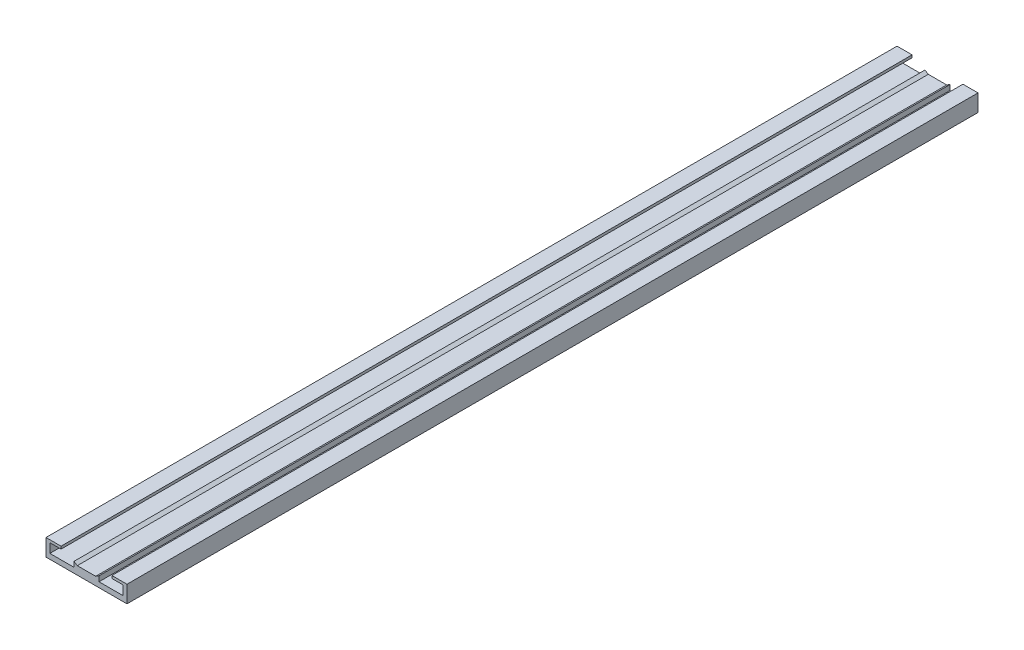
ISO-10303-21;
HEADER;
FILE_DESCRIPTION(('STEP AP214'),'2;1');
FILE_NAME('part.step','',(''),(''),'','','');
FILE_SCHEMA(('AUTOMOTIVE_DESIGN { 1 0 10303 214 1 1 1 1 }'));
ENDSEC;
DATA;
#1=APPLICATION_CONTEXT('core data for automotive mechanical design processes');
#2=APPLICATION_PROTOCOL_DEFINITION('international standard','automotive_design',2000,#1);
#3=PRODUCT_CONTEXT('',#1,'mechanical');
#4=PRODUCT('Part','Part','',(#3));
#5=PRODUCT_RELATED_PRODUCT_CATEGORY('part','',(#4));
#6=PRODUCT_DEFINITION_FORMATION('','',#4);
#7=PRODUCT_DEFINITION_CONTEXT('part definition',#1,'design');
#8=PRODUCT_DEFINITION('design','',#6,#7);
#9=PRODUCT_DEFINITION_SHAPE('','',#8);
#10=(LENGTH_UNIT() NAMED_UNIT(*) SI_UNIT(.MILLI.,.METRE.));
#11=(NAMED_UNIT(*) PLANE_ANGLE_UNIT() SI_UNIT($,.RADIAN.));
#12=(NAMED_UNIT(*) SI_UNIT($,.STERADIAN.) SOLID_ANGLE_UNIT());
#13=UNCERTAINTY_MEASURE_WITH_UNIT(LENGTH_MEASURE(1.E-05),#10,'distance_accuracy_value','');
#14=(GEOMETRIC_REPRESENTATION_CONTEXT(3) GLOBAL_UNCERTAINTY_ASSIGNED_CONTEXT((#13)) GLOBAL_UNIT_ASSIGNED_CONTEXT((#10,
#11,#12)) REPRESENTATION_CONTEXT('',''));
#15=CARTESIAN_POINT('',(0.,0.,0.));
#16=DIRECTION('',(0.,0.,1.));
#17=DIRECTION('',(1.,0.,0.));
#18=AXIS2_PLACEMENT_3D('',#15,#16,#17);
#19=CARTESIAN_POINT('',(0.,0.,419.1));
#20=DIRECTION('',(0.,1.,0.));
#21=DIRECTION('',(0.,0.,1.));
#22=AXIS2_PLACEMENT_3D('',#19,#20,#21);
#23=PLANE('',#22);
#24=DIRECTION('',(1.,0.,0.));
#25=VECTOR('',#24,1.);
#26=CARTESIAN_POINT('',(0.,0.,0.));
#27=LINE('',#26,#25);
#28=CARTESIAN_POINT('',(-19.939,0.,0.));
#29=VERTEX_POINT('',#28);
#30=CARTESIAN_POINT('',(19.939,0.,0.));
#31=VERTEX_POINT('',#30);
#32=EDGE_CURVE('E116',#29,#31,#27,.T.);
#33=ORIENTED_EDGE('',*,*,#32,.T.);
#34=DIRECTION('',(0.,0.,-1.));
#35=VECTOR('',#34,1.);
#36=CARTESIAN_POINT('',(19.939,0.,419.1));
#37=LINE('',#36,#35);
#38=CARTESIAN_POINT('',(19.939,0.,419.1));
#39=VERTEX_POINT('',#38);
#40=EDGE_CURVE('E11',#39,#31,#37,.T.);
#41=ORIENTED_EDGE('',*,*,#40,.F.);
#42=DIRECTION('',(1.,0.,0.));
#43=VECTOR('',#42,1.);
#44=CARTESIAN_POINT('',(0.,0.,419.1));
#45=LINE('',#44,#43);
#46=CARTESIAN_POINT('',(-19.939,0.,419.1));
#47=VERTEX_POINT('',#46);
#48=EDGE_CURVE('E122',#47,#39,#45,.T.);
#49=ORIENTED_EDGE('',*,*,#48,.F.);
#50=DIRECTION('',(0.,0.,-1.));
#51=VECTOR('',#50,1.);
#52=CARTESIAN_POINT('',(-19.939,0.,419.1));
#53=LINE('',#52,#51);
#54=EDGE_CURVE('E186',#47,#29,#53,.T.);
#55=ORIENTED_EDGE('',*,*,#54,.T.);
#56=EDGE_LOOP('',(#33,#41,#49,#55));
#57=FACE_BOUND('',#56,.T.);
#58=ADVANCED_FACE('F34',(#57),#23,.F.);
#59=CARTESIAN_POINT('',(19.939,0.,419.1));
#60=DIRECTION('',(-1.,0.,0.));
#61=DIRECTION('',(0.,0.,1.));
#62=AXIS2_PLACEMENT_3D('',#59,#60,#61);
#63=PLANE('',#62);
#64=DIRECTION('',(0.,1.,0.));
#65=VECTOR('',#64,1.);
#66=CARTESIAN_POINT('',(19.939,0.,0.));
#67=LINE('',#66,#65);
#68=CARTESIAN_POINT('',(19.939,8.382,0.));
#69=VERTEX_POINT('',#68);
#70=EDGE_CURVE('E191',#31,#69,#67,.T.);
#71=ORIENTED_EDGE('',*,*,#70,.T.);
#72=DIRECTION('',(0.,0.,-1.));
#73=VECTOR('',#72,1.);
#74=CARTESIAN_POINT('',(19.939,8.382,419.1));
#75=LINE('',#74,#73);
#76=CARTESIAN_POINT('',(19.939,8.382,419.1));
#77=VERTEX_POINT('',#76);
#78=EDGE_CURVE('E42',#77,#69,#75,.T.);
#79=ORIENTED_EDGE('',*,*,#78,.F.);
#80=DIRECTION('',(0.,1.,0.));
#81=VECTOR('',#80,1.);
#82=CARTESIAN_POINT('',(19.939,0.,419.1));
#83=LINE('',#82,#81);
#84=EDGE_CURVE('E321',#39,#77,#83,.T.);
#85=ORIENTED_EDGE('',*,*,#84,.F.);
#86=ORIENTED_EDGE('',*,*,#40,.T.);
#87=EDGE_LOOP('',(#71,#79,#85,#86));
#88=FACE_BOUND('',#87,.T.);
#89=ADVANCED_FACE('F324',(#88),#63,.F.);
#90=CARTESIAN_POINT('',(19.939,8.382,419.1));
#91=DIRECTION('',(0.,-1.,0.));
#92=DIRECTION('',(1.,0.,0.));
#93=AXIS2_PLACEMENT_3D('',#90,#91,#92);
#94=PLANE('',#93);
#95=DIRECTION('',(-1.,0.,0.));
#96=VECTOR('',#95,1.);
#97=CARTESIAN_POINT('',(19.939,8.382,0.));
#98=LINE('',#97,#96);
#99=CARTESIAN_POINT('',(12.5222,8.382,0.));
#100=VERTEX_POINT('',#99);
#101=EDGE_CURVE('E193',#69,#100,#98,.T.);
#102=ORIENTED_EDGE('',*,*,#101,.T.);
#103=DIRECTION('',(0.,0.,-1.));
#104=VECTOR('',#103,1.);
#105=CARTESIAN_POINT('',(12.5222,8.382,419.1));
#106=LINE('',#105,#104);
#107=CARTESIAN_POINT('',(12.5222,8.382,419.1));
#108=VERTEX_POINT('',#107);
#109=EDGE_CURVE('E260',#108,#100,#106,.T.);
#110=ORIENTED_EDGE('',*,*,#109,.F.);
#111=DIRECTION('',(-1.,0.,0.));
#112=VECTOR('',#111,1.);
#113=CARTESIAN_POINT('',(19.939,8.382,419.1));
#114=LINE('',#113,#112);
#115=EDGE_CURVE('E269',#77,#108,#114,.T.);
#116=ORIENTED_EDGE('',*,*,#115,.F.);
#117=ORIENTED_EDGE('',*,*,#78,.T.);
#118=EDGE_LOOP('',(#102,#110,#116,#117));
#119=FACE_BOUND('',#118,.T.);
#120=ADVANCED_FACE('F267',(#119),#94,.F.);
#121=CARTESIAN_POINT('',(12.5222,8.382,419.1));
#122=DIRECTION('',(1.,0.,0.));
#123=DIRECTION('',(0.,0.,-1.));
#124=AXIS2_PLACEMENT_3D('',#121,#122,#123);
#125=PLANE('',#124);
#126=DIRECTION('',(0.,-1.,0.));
#127=VECTOR('',#126,1.);
#128=CARTESIAN_POINT('',(12.5222,8.382,0.));
#129=LINE('',#128,#127);
#130=CARTESIAN_POINT('',(12.5222,7.112,0.));
#131=VERTEX_POINT('',#130);
#132=EDGE_CURVE('E195',#100,#131,#129,.T.);
#133=ORIENTED_EDGE('',*,*,#132,.T.);
#134=DIRECTION('',(0.,0.,-1.));
#135=VECTOR('',#134,1.);
#136=CARTESIAN_POINT('',(12.5222,7.112,419.1));
#137=LINE('',#136,#135);
#138=CARTESIAN_POINT('',(12.5222,7.112,419.1));
#139=VERTEX_POINT('',#138);
#140=EDGE_CURVE('E257',#139,#131,#137,.T.);
#141=ORIENTED_EDGE('',*,*,#140,.F.);
#142=DIRECTION('',(0.,-1.,0.));
#143=VECTOR('',#142,1.);
#144=CARTESIAN_POINT('',(12.5222,8.382,419.1));
#145=LINE('',#144,#143);
#146=EDGE_CURVE('E287',#108,#139,#145,.T.);
#147=ORIENTED_EDGE('',*,*,#146,.F.);
#148=ORIENTED_EDGE('',*,*,#109,.T.);
#149=EDGE_LOOP('',(#133,#141,#147,#148));
#150=FACE_BOUND('',#149,.T.);
#151=ADVANCED_FACE('F278',(#150),#125,.F.);
#152=CARTESIAN_POINT('',(12.5222,7.112,419.1));
#153=DIRECTION('',(0.,1.,0.));
#154=DIRECTION('',(0.,0.,1.));
#155=AXIS2_PLACEMENT_3D('',#152,#153,#154);
#156=PLANE('',#155);
#157=DIRECTION('',(1.,0.,0.));
#158=VECTOR('',#157,1.);
#159=CARTESIAN_POINT('',(12.5222,7.112,0.));
#160=LINE('',#159,#158);
#161=CARTESIAN_POINT('',(18.034,7.112,0.));
#162=VERTEX_POINT('',#161);
#163=EDGE_CURVE('E197',#131,#162,#160,.T.);
#164=ORIENTED_EDGE('',*,*,#163,.T.);
#165=DIRECTION('',(0.,0.,-1.));
#166=VECTOR('',#165,1.);
#167=CARTESIAN_POINT('',(18.034,7.112,419.1));
#168=LINE('',#167,#166);
#169=CARTESIAN_POINT('',(18.034,7.112,419.1));
#170=VERTEX_POINT('',#169);
#171=EDGE_CURVE('E254',#170,#162,#168,.T.);
#172=ORIENTED_EDGE('',*,*,#171,.F.);
#173=DIRECTION('',(1.,0.,0.));
#174=VECTOR('',#173,1.);
#175=CARTESIAN_POINT('',(12.5222,7.112,419.1));
#176=LINE('',#175,#174);
#177=EDGE_CURVE('E284',#139,#170,#176,.T.);
#178=ORIENTED_EDGE('',*,*,#177,.F.);
#179=ORIENTED_EDGE('',*,*,#140,.T.);
#180=EDGE_LOOP('',(#164,#172,#178,#179));
#181=FACE_BOUND('',#180,.T.);
#182=ADVANCED_FACE('F282',(#181),#156,.F.);
#183=CARTESIAN_POINT('',(18.034,7.112,419.1));
#184=DIRECTION('',(1.,0.,0.));
#185=DIRECTION('',(0.,0.,-1.));
#186=AXIS2_PLACEMENT_3D('',#183,#184,#185);
#187=PLANE('',#186);
#188=DIRECTION('',(0.,-1.,0.));
#189=VECTOR('',#188,1.);
#190=CARTESIAN_POINT('',(18.034,7.112,0.));
#191=LINE('',#190,#189);
#192=CARTESIAN_POINT('',(18.034,2.54,0.));
#193=VERTEX_POINT('',#192);
#194=EDGE_CURVE('E199',#162,#193,#191,.T.);
#195=ORIENTED_EDGE('',*,*,#194,.T.);
#196=DIRECTION('',(0.,0.,-1.));
#197=VECTOR('',#196,1.);
#198=CARTESIAN_POINT('',(18.034,2.54,419.1));
#199=LINE('',#198,#197);
#200=CARTESIAN_POINT('',(18.034,2.54,419.1));
#201=VERTEX_POINT('',#200);
#202=EDGE_CURVE('E251',#201,#193,#199,.T.);
#203=ORIENTED_EDGE('',*,*,#202,.F.);
#204=DIRECTION('',(0.,-1.,0.));
#205=VECTOR('',#204,1.);
#206=CARTESIAN_POINT('',(18.034,7.112,419.1));
#207=LINE('',#206,#205);
#208=EDGE_CURVE('E286',#170,#201,#207,.T.);
#209=ORIENTED_EDGE('',*,*,#208,.F.);
#210=ORIENTED_EDGE('',*,*,#171,.T.);
#211=EDGE_LOOP('',(#195,#203,#209,#210));
#212=FACE_BOUND('',#211,.T.);
#213=ADVANCED_FACE('F336',(#212),#187,.F.);
#214=CARTESIAN_POINT('',(18.034,2.54,419.1));
#215=DIRECTION('',(0.,-1.,0.));
#216=DIRECTION('',(1.,0.,0.));
#217=AXIS2_PLACEMENT_3D('',#214,#215,#216);
#218=PLANE('',#217);
#219=DIRECTION('',(-1.,0.,0.));
#220=VECTOR('',#219,1.);
#221=CARTESIAN_POINT('',(18.034,2.54,0.));
#222=LINE('',#221,#220);
#223=CARTESIAN_POINT('',(6.1722,2.54,0.));
#224=VERTEX_POINT('',#223);
#225=EDGE_CURVE('E201',#193,#224,#222,.T.);
#226=ORIENTED_EDGE('',*,*,#225,.T.);
#227=DIRECTION('',(0.,0.,-1.));
#228=VECTOR('',#227,1.);
#229=CARTESIAN_POINT('',(6.1722,2.54,419.1));
#230=LINE('',#229,#228);
#231=CARTESIAN_POINT('',(6.1722,2.54,419.1));
#232=VERTEX_POINT('',#231);
#233=EDGE_CURVE('E248',#232,#224,#230,.T.);
#234=ORIENTED_EDGE('',*,*,#233,.F.);
#235=DIRECTION('',(-1.,0.,0.));
#236=VECTOR('',#235,1.);
#237=CARTESIAN_POINT('',(18.034,2.54,419.1));
#238=LINE('',#237,#236);
#239=EDGE_CURVE('E289',#201,#232,#238,.T.);
#240=ORIENTED_EDGE('',*,*,#239,.F.);
#241=ORIENTED_EDGE('',*,*,#202,.T.);
#242=EDGE_LOOP('',(#226,#234,#240,#241));
#243=FACE_BOUND('',#242,.T.);
#244=ADVANCED_FACE('F339',(#243),#218,.F.);
#245=CARTESIAN_POINT('',(6.1722,2.54,419.1));
#246=DIRECTION('',(-1.,0.,0.));
#247=DIRECTION('',(0.,0.,1.));
#248=AXIS2_PLACEMENT_3D('',#245,#246,#247);
#249=PLANE('',#248);
#250=DIRECTION('',(0.,1.,0.));
#251=VECTOR('',#250,1.);
#252=CARTESIAN_POINT('',(6.1722,2.54,0.));
#253=LINE('',#252,#251);
#254=CARTESIAN_POINT('',(6.1722,5.08,0.));
#255=VERTEX_POINT('',#254);
#256=EDGE_CURVE('E203',#224,#255,#253,.T.);
#257=ORIENTED_EDGE('',*,*,#256,.T.);
#258=DIRECTION('',(0.,0.,-1.));
#259=VECTOR('',#258,1.);
#260=CARTESIAN_POINT('',(6.1722,5.08,419.1));
#261=LINE('',#260,#259);
#262=CARTESIAN_POINT('',(6.1722,5.08,419.1));
#263=VERTEX_POINT('',#262);
#264=EDGE_CURVE('E245',#263,#255,#261,.T.);
#265=ORIENTED_EDGE('',*,*,#264,.F.);
#266=DIRECTION('',(0.,1.,0.));
#267=VECTOR('',#266,1.);
#268=CARTESIAN_POINT('',(6.1722,2.54,419.1));
#269=LINE('',#268,#267);
#270=EDGE_CURVE('E295',#232,#263,#269,.T.);
#271=ORIENTED_EDGE('',*,*,#270,.F.);
#272=ORIENTED_EDGE('',*,*,#233,.T.);
#273=EDGE_LOOP('',(#257,#265,#271,#272));
#274=FACE_BOUND('',#273,.T.);
#275=ADVANCED_FACE('F343',(#274),#249,.F.);
#276=CARTESIAN_POINT('',(4.5308017667854,4.064,419.1));
#277=DIRECTION('',(0.526315789473685,-0.850289180073869,0.));
#278=DIRECTION('',(0.850289180073869,0.526315789473685,0.));
#279=AXIS2_PLACEMENT_3D('',#276,#277,#278);
#280=PLANE('',#279);
#281=DIRECTION('',(-0.850289180073869,-0.526315789473684,0.));
#282=VECTOR('',#281,1.);
#283=CARTESIAN_POINT('',(4.5308017667854,4.064,0.));
#284=LINE('',#283,#282);
#285=CARTESIAN_POINT('',(4.5308017667854,4.064,0.));
#286=VERTEX_POINT('',#285);
#287=EDGE_CURVE('E205',#255,#286,#284,.T.);
#288=ORIENTED_EDGE('',*,*,#287,.T.);
#289=DIRECTION('',(0.,0.,-1.));
#290=VECTOR('',#289,1.);
#291=CARTESIAN_POINT('',(4.5308017667854,4.064,419.1));
#292=LINE('',#291,#290);
#293=CARTESIAN_POINT('',(4.5308017667854,4.064,419.1));
#294=VERTEX_POINT('',#293);
#295=EDGE_CURVE('E242',#294,#286,#292,.T.);
#296=ORIENTED_EDGE('',*,*,#295,.F.);
#297=DIRECTION('',(-0.850289180073869,-0.526315789473684,0.));
#298=VECTOR('',#297,1.);
#299=CARTESIAN_POINT('',(4.5308017667854,4.064,419.1));
#300=LINE('',#299,#298);
#301=EDGE_CURVE('E297',#263,#294,#300,.T.);
#302=ORIENTED_EDGE('',*,*,#301,.F.);
#303=ORIENTED_EDGE('',*,*,#264,.T.);
#304=EDGE_LOOP('',(#288,#296,#302,#303));
#305=FACE_BOUND('',#304,.T.);
#306=ADVANCED_FACE('F347',(#305),#280,.F.);
#307=CARTESIAN_POINT('',(-4.5308017667854,4.064,419.1));
#308=DIRECTION('',(0.,-1.,0.));
#309=DIRECTION('',(0.,0.,-1.));
#310=AXIS2_PLACEMENT_3D('',#307,#308,#309);
#311=PLANE('',#310);
#312=DIRECTION('',(-1.,0.,0.));
#313=VECTOR('',#312,1.);
#314=CARTESIAN_POINT('',(-4.5308017667854,4.064,0.));
#315=LINE('',#314,#313);
#316=CARTESIAN_POINT('',(-4.5308017667854,4.064,0.));
#317=VERTEX_POINT('',#316);
#318=EDGE_CURVE('E207',#286,#317,#315,.T.);
#319=ORIENTED_EDGE('',*,*,#318,.T.);
#320=DIRECTION('',(0.,0.,-1.));
#321=VECTOR('',#320,1.);
#322=CARTESIAN_POINT('',(-4.5308017667854,4.064,419.1));
#323=LINE('',#322,#321);
#324=CARTESIAN_POINT('',(-4.5308017667854,4.064,419.1));
#325=VERTEX_POINT('',#324);
#326=EDGE_CURVE('E239',#325,#317,#323,.T.);
#327=ORIENTED_EDGE('',*,*,#326,.F.);
#328=DIRECTION('',(-1.,0.,0.));
#329=VECTOR('',#328,1.);
#330=CARTESIAN_POINT('',(-4.5308017667854,4.064,419.1));
#331=LINE('',#330,#329);
#332=EDGE_CURVE('E299',#294,#325,#331,.T.);
#333=ORIENTED_EDGE('',*,*,#332,.F.);
#334=ORIENTED_EDGE('',*,*,#295,.T.);
#335=EDGE_LOOP('',(#319,#327,#333,#334));
#336=FACE_BOUND('',#335,.T.);
#337=ADVANCED_FACE('F351',(#336),#311,.F.);
#338=CARTESIAN_POINT('',(-6.1722,5.08,419.1));
#339=DIRECTION('',(-0.526315789473684,-0.850289180073869,0.));
#340=DIRECTION('',(0.850289180073869,-0.526315789473684,0.));
#341=AXIS2_PLACEMENT_3D('',#338,#339,#340);
#342=PLANE('',#341);
#343=DIRECTION('',(-0.850289180073869,0.526315789473684,0.));
#344=VECTOR('',#343,1.);
#345=CARTESIAN_POINT('',(-6.1722,5.08,0.));
#346=LINE('',#345,#344);
#347=CARTESIAN_POINT('',(-6.1722,5.08,0.));
#348=VERTEX_POINT('',#347);
#349=EDGE_CURVE('E209',#317,#348,#346,.T.);
#350=ORIENTED_EDGE('',*,*,#349,.T.);
#351=DIRECTION('',(0.,0.,-1.));
#352=VECTOR('',#351,1.);
#353=CARTESIAN_POINT('',(-6.1722,5.08,419.1));
#354=LINE('',#353,#352);
#355=CARTESIAN_POINT('',(-6.1722,5.08,419.1));
#356=VERTEX_POINT('',#355);
#357=EDGE_CURVE('E236',#356,#348,#354,.T.);
#358=ORIENTED_EDGE('',*,*,#357,.F.);
#359=DIRECTION('',(-0.850289180073869,0.526315789473684,0.));
#360=VECTOR('',#359,1.);
#361=CARTESIAN_POINT('',(-6.1722,5.08,419.1));
#362=LINE('',#361,#360);
#363=EDGE_CURVE('E301',#325,#356,#362,.T.);
#364=ORIENTED_EDGE('',*,*,#363,.F.);
#365=ORIENTED_EDGE('',*,*,#326,.T.);
#366=EDGE_LOOP('',(#350,#358,#364,#365));
#367=FACE_BOUND('',#366,.T.);
#368=ADVANCED_FACE('F355',(#367),#342,.F.);
#369=CARTESIAN_POINT('',(-6.1722,2.54,419.1));
#370=DIRECTION('',(1.,0.,0.));
#371=DIRECTION('',(0.,0.,-1.));
#372=AXIS2_PLACEMENT_3D('',#369,#370,#371);
#373=PLANE('',#372);
#374=DIRECTION('',(0.,-1.,0.));
#375=VECTOR('',#374,1.);
#376=CARTESIAN_POINT('',(-6.1722,2.54,0.));
#377=LINE('',#376,#375);
#378=CARTESIAN_POINT('',(-6.1722,2.54,0.));
#379=VERTEX_POINT('',#378);
#380=EDGE_CURVE('E211',#348,#379,#377,.T.);
#381=ORIENTED_EDGE('',*,*,#380,.T.);
#382=DIRECTION('',(0.,0.,-1.));
#383=VECTOR('',#382,1.);
#384=CARTESIAN_POINT('',(-6.1722,2.54,419.1));
#385=LINE('',#384,#383);
#386=CARTESIAN_POINT('',(-6.1722,2.54,419.1));
#387=VERTEX_POINT('',#386);
#388=EDGE_CURVE('E233',#387,#379,#385,.T.);
#389=ORIENTED_EDGE('',*,*,#388,.F.);
#390=DIRECTION('',(0.,-1.,0.));
#391=VECTOR('',#390,1.);
#392=CARTESIAN_POINT('',(-6.1722,2.54,419.1));
#393=LINE('',#392,#391);
#394=EDGE_CURVE('E303',#356,#387,#393,.T.);
#395=ORIENTED_EDGE('',*,*,#394,.F.);
#396=ORIENTED_EDGE('',*,*,#357,.T.);
#397=EDGE_LOOP('',(#381,#389,#395,#396));
#398=FACE_BOUND('',#397,.T.);
#399=ADVANCED_FACE('F359',(#398),#373,.F.);
#400=CARTESIAN_POINT('',(-18.034,2.54,419.1));
#401=DIRECTION('',(0.,-1.,0.));
#402=DIRECTION('',(0.,0.,-1.));
#403=AXIS2_PLACEMENT_3D('',#400,#401,#402);
#404=PLANE('',#403);
#405=DIRECTION('',(-1.,0.,0.));
#406=VECTOR('',#405,1.);
#407=CARTESIAN_POINT('',(-18.034,2.54,0.));
#408=LINE('',#407,#406);
#409=CARTESIAN_POINT('',(-18.034,2.54,0.));
#410=VERTEX_POINT('',#409);
#411=EDGE_CURVE('E213',#379,#410,#408,.T.);
#412=ORIENTED_EDGE('',*,*,#411,.T.);
#413=DIRECTION('',(0.,0.,-1.));
#414=VECTOR('',#413,1.);
#415=CARTESIAN_POINT('',(-18.034,2.54,419.1));
#416=LINE('',#415,#414);
#417=CARTESIAN_POINT('',(-18.034,2.54,419.1));
#418=VERTEX_POINT('',#417);
#419=EDGE_CURVE('E230',#418,#410,#416,.T.);
#420=ORIENTED_EDGE('',*,*,#419,.F.);
#421=DIRECTION('',(-1.,0.,0.));
#422=VECTOR('',#421,1.);
#423=CARTESIAN_POINT('',(-18.034,2.54,419.1));
#424=LINE('',#423,#422);
#425=EDGE_CURVE('E305',#387,#418,#424,.T.);
#426=ORIENTED_EDGE('',*,*,#425,.F.);
#427=ORIENTED_EDGE('',*,*,#388,.T.);
#428=EDGE_LOOP('',(#412,#420,#426,#427));
#429=FACE_BOUND('',#428,.T.);
#430=ADVANCED_FACE('F363',(#429),#404,.F.);
#431=CARTESIAN_POINT('',(-18.034,7.112,419.1));
#432=DIRECTION('',(-1.,0.,0.));
#433=DIRECTION('',(0.,0.,1.));
#434=AXIS2_PLACEMENT_3D('',#431,#432,#433);
#435=PLANE('',#434);
#436=DIRECTION('',(0.,1.,0.));
#437=VECTOR('',#436,1.);
#438=CARTESIAN_POINT('',(-18.034,7.112,0.));
#439=LINE('',#438,#437);
#440=CARTESIAN_POINT('',(-18.034,7.112,0.));
#441=VERTEX_POINT('',#440);
#442=EDGE_CURVE('E215',#410,#441,#439,.T.);
#443=ORIENTED_EDGE('',*,*,#442,.T.);
#444=DIRECTION('',(0.,0.,-1.));
#445=VECTOR('',#444,1.);
#446=CARTESIAN_POINT('',(-18.034,7.112,419.1));
#447=LINE('',#446,#445);
#448=CARTESIAN_POINT('',(-18.034,7.112,419.1));
#449=VERTEX_POINT('',#448);
#450=EDGE_CURVE('E227',#449,#441,#447,.T.);
#451=ORIENTED_EDGE('',*,*,#450,.F.);
#452=DIRECTION('',(0.,1.,0.));
#453=VECTOR('',#452,1.);
#454=CARTESIAN_POINT('',(-18.034,7.112,419.1));
#455=LINE('',#454,#453);
#456=EDGE_CURVE('E307',#418,#449,#455,.T.);
#457=ORIENTED_EDGE('',*,*,#456,.F.);
#458=ORIENTED_EDGE('',*,*,#419,.T.);
#459=EDGE_LOOP('',(#443,#451,#457,#458));
#460=FACE_BOUND('',#459,.T.);
#461=ADVANCED_FACE('F313',(#460),#435,.F.);
#462=CARTESIAN_POINT('',(-18.034,7.112,419.1));
#463=DIRECTION('',(0.,1.,0.));
#464=DIRECTION('',(0.,0.,1.));
#465=AXIS2_PLACEMENT_3D('',#462,#463,#464);
#466=PLANE('',#465);
#467=DIRECTION('',(1.,0.,0.));
#468=VECTOR('',#467,1.);
#469=CARTESIAN_POINT('',(-18.034,7.112,0.));
#470=LINE('',#469,#468);
#471=CARTESIAN_POINT('',(-12.5222,7.112,0.));
#472=VERTEX_POINT('',#471);
#473=EDGE_CURVE('E217',#441,#472,#470,.T.);
#474=ORIENTED_EDGE('',*,*,#473,.T.);
#475=DIRECTION('',(0.,0.,-1.));
#476=VECTOR('',#475,1.);
#477=CARTESIAN_POINT('',(-12.5222,7.112,419.1));
#478=LINE('',#477,#476);
#479=CARTESIAN_POINT('',(-12.5222,7.112,419.1));
#480=VERTEX_POINT('',#479);
#481=EDGE_CURVE('E181',#480,#472,#478,.T.);
#482=ORIENTED_EDGE('',*,*,#481,.F.);
#483=DIRECTION('',(1.,0.,0.));
#484=VECTOR('',#483,1.);
#485=CARTESIAN_POINT('',(-18.034,7.112,419.1));
#486=LINE('',#485,#484);
#487=EDGE_CURVE('E172',#449,#480,#486,.T.);
#488=ORIENTED_EDGE('',*,*,#487,.F.);
#489=ORIENTED_EDGE('',*,*,#450,.T.);
#490=EDGE_LOOP('',(#474,#482,#488,#489));
#491=FACE_BOUND('',#490,.T.);
#492=ADVANCED_FACE('F317',(#491),#466,.F.);
#493=CARTESIAN_POINT('',(-12.5222,8.382,419.1));
#494=DIRECTION('',(-1.,0.,0.));
#495=DIRECTION('',(0.,0.,1.));
#496=AXIS2_PLACEMENT_3D('',#493,#494,#495);
#497=PLANE('',#496);
#498=DIRECTION('',(0.,1.,0.));
#499=VECTOR('',#498,1.);
#500=CARTESIAN_POINT('',(-12.5222,8.382,0.));
#501=LINE('',#500,#499);
#502=CARTESIAN_POINT('',(-12.5222,8.382,0.));
#503=VERTEX_POINT('',#502);
#504=EDGE_CURVE('E180',#472,#503,#501,.T.);
#505=ORIENTED_EDGE('',*,*,#504,.T.);
#506=DIRECTION('',(0.,0.,-1.));
#507=VECTOR('',#506,1.);
#508=CARTESIAN_POINT('',(-12.5222,8.382,419.1));
#509=LINE('',#508,#507);
#510=CARTESIAN_POINT('',(-12.5222,8.382,419.1));
#511=VERTEX_POINT('',#510);
#512=EDGE_CURVE('E177',#511,#503,#509,.T.);
#513=ORIENTED_EDGE('',*,*,#512,.F.);
#514=DIRECTION('',(0.,1.,0.));
#515=VECTOR('',#514,1.);
#516=CARTESIAN_POINT('',(-12.5222,8.382,419.1));
#517=LINE('',#516,#515);
#518=EDGE_CURVE('E166',#480,#511,#517,.T.);
#519=ORIENTED_EDGE('',*,*,#518,.F.);
#520=ORIENTED_EDGE('',*,*,#481,.T.);
#521=EDGE_LOOP('',(#505,#513,#519,#520));
#522=FACE_BOUND('',#521,.T.);
#523=ADVANCED_FACE('F178',(#522),#497,.F.);
#524=CARTESIAN_POINT('',(-19.939,8.382,419.1));
#525=DIRECTION('',(0.,-1.,0.));
#526=DIRECTION('',(0.,0.,-1.));
#527=AXIS2_PLACEMENT_3D('',#524,#525,#526);
#528=PLANE('',#527);
#529=DIRECTION('',(-1.,0.,0.));
#530=VECTOR('',#529,1.);
#531=CARTESIAN_POINT('',(-19.939,8.382,0.));
#532=LINE('',#531,#530);
#533=CARTESIAN_POINT('',(-19.939,8.382,0.));
#534=VERTEX_POINT('',#533);
#535=EDGE_CURVE('E109',#503,#534,#532,.T.);
#536=ORIENTED_EDGE('',*,*,#535,.T.);
#537=DIRECTION('',(0.,0.,-1.));
#538=VECTOR('',#537,1.);
#539=CARTESIAN_POINT('',(-19.939,8.382,419.1));
#540=LINE('',#539,#538);
#541=CARTESIAN_POINT('',(-19.939,8.382,419.1));
#542=VERTEX_POINT('',#541);
#543=EDGE_CURVE('E182',#542,#534,#540,.T.);
#544=ORIENTED_EDGE('',*,*,#543,.F.);
#545=DIRECTION('',(-1.,0.,0.));
#546=VECTOR('',#545,1.);
#547=CARTESIAN_POINT('',(-19.939,8.382,419.1));
#548=LINE('',#547,#546);
#549=EDGE_CURVE('E170',#511,#542,#548,.T.);
#550=ORIENTED_EDGE('',*,*,#549,.F.);
#551=ORIENTED_EDGE('',*,*,#512,.T.);
#552=EDGE_LOOP('',(#536,#544,#550,#551));
#553=FACE_BOUND('',#552,.T.);
#554=ADVANCED_FACE('F184',(#553),#528,.F.);
#555=CARTESIAN_POINT('',(-19.939,0.,419.1));
#556=DIRECTION('',(1.,0.,0.));
#557=DIRECTION('',(0.,0.,-1.));
#558=AXIS2_PLACEMENT_3D('',#555,#556,#557);
#559=PLANE('',#558);
#560=DIRECTION('',(0.,-1.,0.));
#561=VECTOR('',#560,1.);
#562=CARTESIAN_POINT('',(-19.939,0.,0.));
#563=LINE('',#562,#561);
#564=EDGE_CURVE('E221',#534,#29,#563,.T.);
#565=ORIENTED_EDGE('',*,*,#564,.T.);
#566=ORIENTED_EDGE('',*,*,#54,.F.);
#567=DIRECTION('',(0.,-1.,0.));
#568=VECTOR('',#567,1.);
#569=CARTESIAN_POINT('',(-19.939,0.,419.1));
#570=LINE('',#569,#568);
#571=EDGE_CURVE('E50',#542,#47,#570,.T.);
#572=ORIENTED_EDGE('',*,*,#571,.F.);
#573=ORIENTED_EDGE('',*,*,#543,.T.);
#574=EDGE_LOOP('',(#565,#566,#572,#573));
#575=FACE_BOUND('',#574,.T.);
#576=ADVANCED_FACE('F319',(#575),#559,.F.);
#577=CARTESIAN_POINT('',(0.,0.,419.1));
#578=DIRECTION('',(0.,0.,-1.));
#579=DIRECTION('',(-1.,0.,0.));
#580=AXIS2_PLACEMENT_3D('',#577,#578,#579);
#581=PLANE('',#580);
#582=ORIENTED_EDGE('',*,*,#48,.T.);
#583=ORIENTED_EDGE('',*,*,#84,.T.);
#584=ORIENTED_EDGE('',*,*,#115,.T.);
#585=ORIENTED_EDGE('',*,*,#146,.T.);
#586=ORIENTED_EDGE('',*,*,#177,.T.);
#587=ORIENTED_EDGE('',*,*,#208,.T.);
#588=ORIENTED_EDGE('',*,*,#239,.T.);
#589=ORIENTED_EDGE('',*,*,#270,.T.);
#590=ORIENTED_EDGE('',*,*,#301,.T.);
#591=ORIENTED_EDGE('',*,*,#332,.T.);
#592=ORIENTED_EDGE('',*,*,#363,.T.);
#593=ORIENTED_EDGE('',*,*,#394,.T.);
#594=ORIENTED_EDGE('',*,*,#425,.T.);
#595=ORIENTED_EDGE('',*,*,#456,.T.);
#596=ORIENTED_EDGE('',*,*,#487,.T.);
#597=ORIENTED_EDGE('',*,*,#518,.T.);
#598=ORIENTED_EDGE('',*,*,#549,.T.);
#599=ORIENTED_EDGE('',*,*,#571,.T.);
#600=EDGE_LOOP('',(#582,#583,#584,#585,#586,#587,#588,#589,#590,#591,#592,#593,#594,#595,#596,
#597,#598,#599));
#601=FACE_BOUND('',#600,.T.);
#602=ADVANCED_FACE('F168',(#601),#581,.F.);
#603=CARTESIAN_POINT('',(0.,0.,0.));
#604=DIRECTION('',(0.,0.,-1.));
#605=DIRECTION('',(-1.,0.,0.));
#606=AXIS2_PLACEMENT_3D('',#603,#604,#605);
#607=PLANE('',#606);
#608=ORIENTED_EDGE('',*,*,#32,.F.);
#609=ORIENTED_EDGE('',*,*,#564,.F.);
#610=ORIENTED_EDGE('',*,*,#535,.F.);
#611=ORIENTED_EDGE('',*,*,#504,.F.);
#612=ORIENTED_EDGE('',*,*,#473,.F.);
#613=ORIENTED_EDGE('',*,*,#442,.F.);
#614=ORIENTED_EDGE('',*,*,#411,.F.);
#615=ORIENTED_EDGE('',*,*,#380,.F.);
#616=ORIENTED_EDGE('',*,*,#349,.F.);
#617=ORIENTED_EDGE('',*,*,#318,.F.);
#618=ORIENTED_EDGE('',*,*,#287,.F.);
#619=ORIENTED_EDGE('',*,*,#256,.F.);
#620=ORIENTED_EDGE('',*,*,#225,.F.);
#621=ORIENTED_EDGE('',*,*,#194,.F.);
#622=ORIENTED_EDGE('',*,*,#163,.F.);
#623=ORIENTED_EDGE('',*,*,#132,.F.);
#624=ORIENTED_EDGE('',*,*,#101,.F.);
#625=ORIENTED_EDGE('',*,*,#70,.F.);
#626=EDGE_LOOP('',(#608,#609,#610,#611,#612,#613,#614,#615,#616,#617,#618,#619,#620,#621,#622,
#623,#624,#625));
#627=FACE_BOUND('',#626,.T.);
#628=ADVANCED_FACE('F273',(#627),#607,.T.);
#629=CLOSED_SHELL('',(#58,#89,#120,#151,#182,#213,#244,#275,#306,#337,#368,#399,#430,#461,#492,
#523,#554,#576,#602,#628));
#630=MANIFOLD_SOLID_BREP('B2',#629);
#631=ADVANCED_BREP_SHAPE_REPRESENTATION('',(#18,#630),#14);
#632=SHAPE_DEFINITION_REPRESENTATION(#9,#631);
ENDSEC;
END-ISO-10303-21;
